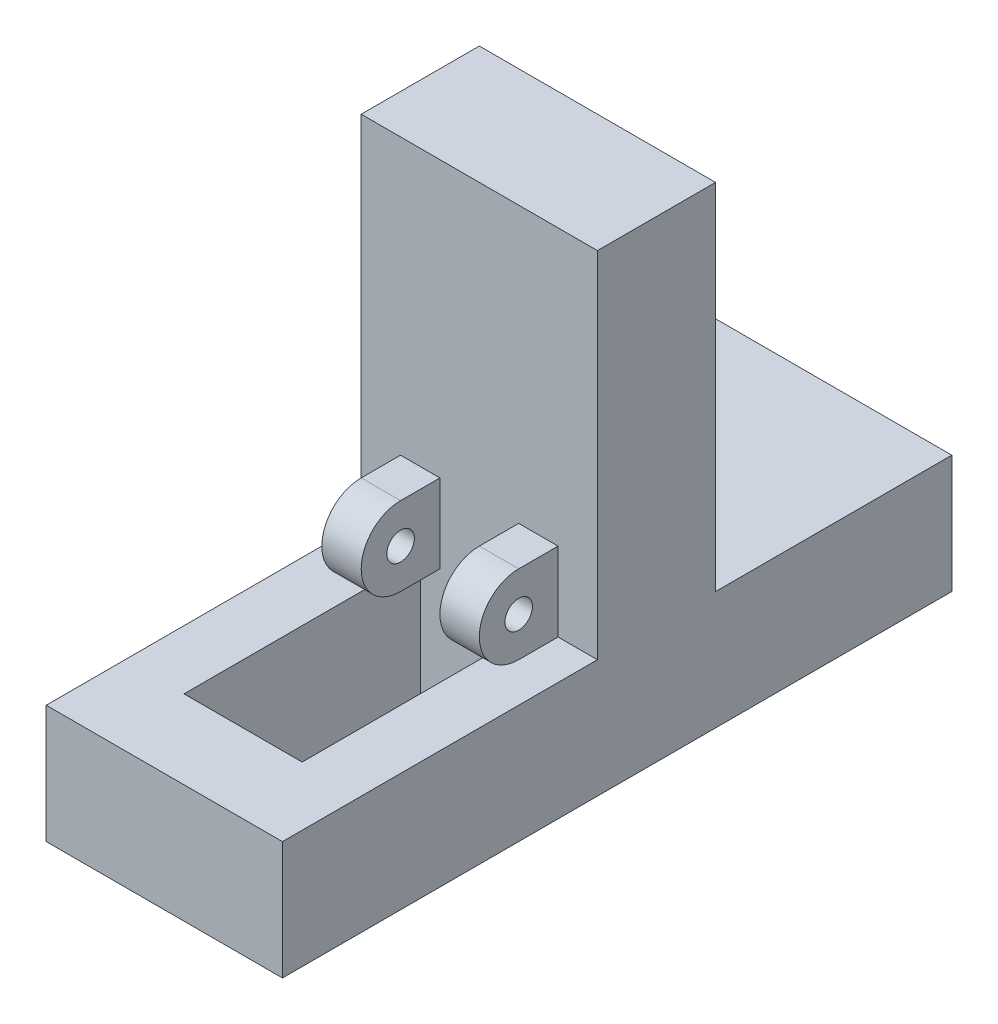
ISO-10303-21;
HEADER;
FILE_DESCRIPTION(('STEP AP214'),'2;1');
FILE_NAME('part.step','',(''),(''),'','','');
FILE_SCHEMA(('AUTOMOTIVE_DESIGN { 1 0 10303 214 1 1 1 1 }'));
ENDSEC;
DATA;
#1=APPLICATION_CONTEXT('core data for automotive mechanical design processes');
#2=APPLICATION_PROTOCOL_DEFINITION('international standard','automotive_design',2000,#1);
#3=PRODUCT_CONTEXT('',#1,'mechanical');
#4=PRODUCT('Part','Part','',(#3));
#5=PRODUCT_RELATED_PRODUCT_CATEGORY('part','',(#4));
#6=PRODUCT_DEFINITION_FORMATION('','',#4);
#7=PRODUCT_DEFINITION_CONTEXT('part definition',#1,'design');
#8=PRODUCT_DEFINITION('design','',#6,#7);
#9=PRODUCT_DEFINITION_SHAPE('','',#8);
#10=(LENGTH_UNIT() NAMED_UNIT(*) SI_UNIT(.MILLI.,.METRE.));
#11=(NAMED_UNIT(*) PLANE_ANGLE_UNIT() SI_UNIT($,.RADIAN.));
#12=(NAMED_UNIT(*) SI_UNIT($,.STERADIAN.) SOLID_ANGLE_UNIT());
#13=UNCERTAINTY_MEASURE_WITH_UNIT(LENGTH_MEASURE(1.E-05),#10,'distance_accuracy_value','');
#14=(GEOMETRIC_REPRESENTATION_CONTEXT(3) GLOBAL_UNCERTAINTY_ASSIGNED_CONTEXT((#13)) GLOBAL_UNIT_ASSIGNED_CONTEXT((#10,
#11,#12)) REPRESENTATION_CONTEXT('',''));
#15=CARTESIAN_POINT('',(0.,0.,0.));
#16=DIRECTION('',(0.,0.,1.));
#17=DIRECTION('',(1.,0.,0.));
#18=AXIS2_PLACEMENT_3D('',#15,#16,#17);
#19=CARTESIAN_POINT('',(0.,0.,15.));
#20=DIRECTION('',(0.,0.,-1.));
#21=DIRECTION('',(-1.,0.,0.));
#22=AXIS2_PLACEMENT_3D('',#19,#20,#21);
#23=PLANE('',#22);
#24=CARTESIAN_POINT('',(15.,10.,15.));
#25=DIRECTION('',(0.,0.,1.));
#26=DIRECTION('',(1.,0.,0.));
#27=AXIS2_PLACEMENT_3D('',#24,#25,#26);
#28=CIRCLE('',#27,1.75);
#29=CARTESIAN_POINT('',(16.75,10.,15.));
#30=VERTEX_POINT('',#29);
#31=EDGE_CURVE('E334',#30,#30,#28,.T.);
#32=ORIENTED_EDGE('',*,*,#31,.F.);
#33=EDGE_LOOP('',(#32));
#34=FACE_BOUND('',#33,.T.);
#35=DIRECTION('',(-1.,0.,0.));
#36=VECTOR('',#35,1.);
#37=CARTESIAN_POINT('',(30.,15.,15.));
#38=LINE('',#37,#36);
#39=CARTESIAN_POINT('',(30.,15.,15.));
#40=VERTEX_POINT('',#39);
#41=CARTESIAN_POINT('',(25.,15.,15.));
#42=VERTEX_POINT('',#41);
#43=EDGE_CURVE('E248',#40,#42,#38,.T.);
#44=ORIENTED_EDGE('',*,*,#43,.F.);
#45=DIRECTION('',(0.,1.,0.));
#46=VECTOR('',#45,1.);
#47=CARTESIAN_POINT('',(30.,0.,15.));
#48=LINE('',#47,#46);
#49=CARTESIAN_POINT('',(30.,60.,15.));
#50=VERTEX_POINT('',#49);
#51=EDGE_CURVE('E344',#40,#50,#48,.T.);
#52=ORIENTED_EDGE('',*,*,#51,.T.);
#53=DIRECTION('',(-1.,0.,0.));
#54=VECTOR('',#53,1.);
#55=CARTESIAN_POINT('',(0.,60.,15.));
#56=LINE('',#55,#54);
#57=CARTESIAN_POINT('',(0.,60.,15.));
#58=VERTEX_POINT('',#57);
#59=EDGE_CURVE('E346',#50,#58,#56,.T.);
#60=ORIENTED_EDGE('',*,*,#59,.T.);
#61=DIRECTION('',(0.,-1.,0.));
#62=VECTOR('',#61,1.);
#63=CARTESIAN_POINT('',(0.,0.,15.));
#64=LINE('',#63,#62);
#65=CARTESIAN_POINT('',(0.,15.,15.));
#66=VERTEX_POINT('',#65);
#67=EDGE_CURVE('E338',#58,#66,#64,.T.);
#68=ORIENTED_EDGE('',*,*,#67,.T.);
#69=DIRECTION('',(-1.,0.,0.));
#70=VECTOR('',#69,1.);
#71=CARTESIAN_POINT('',(0.,15.,15.));
#72=LINE('',#71,#70);
#73=CARTESIAN_POINT('',(5.,15.,15.));
#74=VERTEX_POINT('',#73);
#75=EDGE_CURVE('E259',#74,#66,#72,.T.);
#76=ORIENTED_EDGE('',*,*,#75,.F.);
#77=DIRECTION('',(0.,1.,0.));
#78=VECTOR('',#77,1.);
#79=CARTESIAN_POINT('',(5.,25.,15.));
#80=LINE('',#79,#78);
#81=CARTESIAN_POINT('',(5.,25.,15.));
#82=VERTEX_POINT('',#81);
#83=EDGE_CURVE('E274',#74,#82,#80,.T.);
#84=ORIENTED_EDGE('',*,*,#83,.T.);
#85=DIRECTION('',(1.,0.,0.));
#86=VECTOR('',#85,1.);
#87=CARTESIAN_POINT('',(-14.142135623731,25.,15.));
#88=LINE('',#87,#86);
#89=CARTESIAN_POINT('',(10.,25.,15.));
#90=VERTEX_POINT('',#89);
#91=EDGE_CURVE('E331',#82,#90,#88,.T.);
#92=ORIENTED_EDGE('',*,*,#91,.T.);
#93=DIRECTION('',(0.,-1.,0.));
#94=VECTOR('',#93,1.);
#95=CARTESIAN_POINT('',(10.,15.,15.));
#96=LINE('',#95,#94);
#97=CARTESIAN_POINT('',(10.,15.,15.));
#98=VERTEX_POINT('',#97);
#99=EDGE_CURVE('E278',#90,#98,#96,.T.);
#100=ORIENTED_EDGE('',*,*,#99,.T.);
#101=DIRECTION('',(1.,0.,0.));
#102=VECTOR('',#101,1.);
#103=CARTESIAN_POINT('',(-14.142135623731,15.,15.));
#104=LINE('',#103,#102);
#105=CARTESIAN_POINT('',(7.5,15.,15.));
#106=VERTEX_POINT('',#105);
#107=EDGE_CURVE('E322',#106,#98,#104,.T.);
#108=ORIENTED_EDGE('',*,*,#107,.F.);
#109=DIRECTION('',(0.,1.,0.));
#110=VECTOR('',#109,1.);
#111=CARTESIAN_POINT('',(7.5,0.,15.));
#112=LINE('',#111,#110);
#113=CARTESIAN_POINT('',(7.5,0.,15.));
#114=VERTEX_POINT('',#113);
#115=EDGE_CURVE('E254',#114,#106,#112,.T.);
#116=ORIENTED_EDGE('',*,*,#115,.F.);
#117=DIRECTION('',(1.,0.,0.));
#118=VECTOR('',#117,1.);
#119=CARTESIAN_POINT('',(0.,0.,15.));
#120=LINE('',#119,#118);
#121=CARTESIAN_POINT('',(22.5,0.,15.));
#122=VERTEX_POINT('',#121);
#123=EDGE_CURVE('E340',#114,#122,#120,.T.);
#124=ORIENTED_EDGE('',*,*,#123,.T.);
#125=DIRECTION('',(0.,-1.,0.));
#126=VECTOR('',#125,1.);
#127=CARTESIAN_POINT('',(22.5,0.,15.));
#128=LINE('',#127,#126);
#129=CARTESIAN_POINT('',(22.5,15.,15.));
#130=VERTEX_POINT('',#129);
#131=EDGE_CURVE('E246',#130,#122,#128,.T.);
#132=ORIENTED_EDGE('',*,*,#131,.F.);
#133=CARTESIAN_POINT('',(20.,15.,15.));
#134=VERTEX_POINT('',#133);
#135=EDGE_CURVE('E319',#134,#130,#104,.T.);
#136=ORIENTED_EDGE('',*,*,#135,.F.);
#137=DIRECTION('',(0.,1.,0.));
#138=VECTOR('',#137,1.);
#139=CARTESIAN_POINT('',(20.,15.,15.));
#140=LINE('',#139,#138);
#141=CARTESIAN_POINT('',(20.,25.,15.));
#142=VERTEX_POINT('',#141);
#143=EDGE_CURVE('E296',#134,#142,#140,.T.);
#144=ORIENTED_EDGE('',*,*,#143,.T.);
#145=CARTESIAN_POINT('',(25.,25.,15.));
#146=VERTEX_POINT('',#145);
#147=EDGE_CURVE('E318',#142,#146,#88,.T.);
#148=ORIENTED_EDGE('',*,*,#147,.T.);
#149=DIRECTION('',(0.,-1.,0.));
#150=VECTOR('',#149,1.);
#151=CARTESIAN_POINT('',(25.,25.,15.));
#152=LINE('',#151,#150);
#153=EDGE_CURVE('E288',#146,#42,#152,.T.);
#154=ORIENTED_EDGE('',*,*,#153,.T.);
#155=EDGE_LOOP('',(#44,#52,#60,#68,#76,#84,#92,#100,#108,#116,#124,#132,#136,#144,#148,#154));
#156=FACE_BOUND('',#155,.T.);
#157=ADVANCED_FACE('F39',(#34,#156),#23,.F.);
#158=CARTESIAN_POINT('',(-14.142135623731,15.,15.));
#159=DIRECTION('',(0.,-1.,0.));
#160=DIRECTION('',(0.,0.,-1.));
#161=AXIS2_PLACEMENT_3D('',#158,#159,#160);
#162=PLANE('',#161);
#163=ORIENTED_EDGE('',*,*,#135,.T.);
#164=DIRECTION('',(0.,0.,-1.));
#165=VECTOR('',#164,1.);
#166=CARTESIAN_POINT('',(22.5,15.,45.));
#167=LINE('',#166,#165);
#168=CARTESIAN_POINT('',(22.5,15.,20.));
#169=VERTEX_POINT('',#168);
#170=EDGE_CURVE('E238',#169,#130,#167,.T.);
#171=ORIENTED_EDGE('',*,*,#170,.F.);
#172=DIRECTION('',(1.,0.,0.));
#173=VECTOR('',#172,1.);
#174=CARTESIAN_POINT('',(-14.142135623731,15.,20.));
#175=LINE('',#174,#173);
#176=CARTESIAN_POINT('',(20.,15.,20.));
#177=VERTEX_POINT('',#176);
#178=EDGE_CURVE('E324',#177,#169,#175,.T.);
#179=ORIENTED_EDGE('',*,*,#178,.F.);
#180=DIRECTION('',(0.,0.,-1.));
#181=VECTOR('',#180,1.);
#182=CARTESIAN_POINT('',(20.,15.,25.));
#183=LINE('',#182,#181);
#184=EDGE_CURVE('E287',#177,#134,#183,.T.);
#185=ORIENTED_EDGE('',*,*,#184,.T.);
#186=EDGE_LOOP('',(#163,#171,#179,#185));
#187=FACE_BOUND('',#186,.T.);
#188=ADVANCED_FACE('F388',(#187),#162,.T.);
#189=CARTESIAN_POINT('',(7.5,15.,20.));
#190=VERTEX_POINT('',#189);
#191=CARTESIAN_POINT('',(10.,15.,20.));
#192=VERTEX_POINT('',#191);
#193=EDGE_CURVE('E64',#190,#192,#175,.T.);
#194=ORIENTED_EDGE('',*,*,#193,.F.);
#195=DIRECTION('',(0.,0.,-1.));
#196=VECTOR('',#195,1.);
#197=CARTESIAN_POINT('',(7.5,15.,45.));
#198=LINE('',#197,#196);
#199=EDGE_CURVE('E266',#190,#106,#198,.T.);
#200=ORIENTED_EDGE('',*,*,#199,.T.);
#201=ORIENTED_EDGE('',*,*,#107,.T.);
#202=DIRECTION('',(0.,0.,-1.));
#203=VECTOR('',#202,1.);
#204=CARTESIAN_POINT('',(10.,15.,25.));
#205=LINE('',#204,#203);
#206=EDGE_CURVE('E284',#192,#98,#205,.T.);
#207=ORIENTED_EDGE('',*,*,#206,.F.);
#208=EDGE_LOOP('',(#194,#200,#201,#207));
#209=FACE_BOUND('',#208,.T.);
#210=ADVANCED_FACE('F394',(#209),#162,.T.);
#211=CARTESIAN_POINT('',(0.,0.,15.));
#212=DIRECTION('',(1.,0.,0.));
#213=DIRECTION('',(0.,0.,-1.));
#214=AXIS2_PLACEMENT_3D('',#211,#212,#213);
#215=PLANE('',#214);
#216=DIRECTION('',(0.,0.,-1.));
#217=VECTOR('',#216,1.);
#218=CARTESIAN_POINT('',(0.,0.,15.));
#219=LINE('',#218,#217);
#220=CARTESIAN_POINT('',(0.,0.,55.));
#221=VERTEX_POINT('',#220);
#222=CARTESIAN_POINT('',(0.,0.,-30.));
#223=VERTEX_POINT('',#222);
#224=EDGE_CURVE('E11',#221,#223,#219,.T.);
#225=ORIENTED_EDGE('',*,*,#224,.F.);
#226=DIRECTION('',(0.,-1.,0.));
#227=VECTOR('',#226,1.);
#228=CARTESIAN_POINT('',(0.,15.,55.));
#229=LINE('',#228,#227);
#230=CARTESIAN_POINT('',(0.,15.,55.));
#231=VERTEX_POINT('',#230);
#232=EDGE_CURVE('E222',#231,#221,#229,.T.);
#233=ORIENTED_EDGE('',*,*,#232,.F.);
#234=DIRECTION('',(0.,0.,-1.));
#235=VECTOR('',#234,1.);
#236=CARTESIAN_POINT('',(0.,15.,45.));
#237=LINE('',#236,#235);
#238=EDGE_CURVE('E258',#231,#66,#237,.T.);
#239=ORIENTED_EDGE('',*,*,#238,.T.);
#240=ORIENTED_EDGE('',*,*,#67,.F.);
#241=DIRECTION('',(0.,0.,-1.));
#242=VECTOR('',#241,1.);
#243=CARTESIAN_POINT('',(0.,60.,15.));
#244=LINE('',#243,#242);
#245=CARTESIAN_POINT('',(0.,60.,0.));
#246=VERTEX_POINT('',#245);
#247=EDGE_CURVE('E348',#58,#246,#244,.T.);
#248=ORIENTED_EDGE('',*,*,#247,.T.);
#249=DIRECTION('',(0.,-1.,0.));
#250=VECTOR('',#249,1.);
#251=CARTESIAN_POINT('',(0.,0.,0.));
#252=LINE('',#251,#250);
#253=CARTESIAN_POINT('',(0.,15.,0.));
#254=VERTEX_POINT('',#253);
#255=EDGE_CURVE('E337',#246,#254,#252,.T.);
#256=ORIENTED_EDGE('',*,*,#255,.T.);
#257=DIRECTION('',(0.,0.,1.));
#258=VECTOR('',#257,1.);
#259=CARTESIAN_POINT('',(0.,15.,-30.));
#260=LINE('',#259,#258);
#261=CARTESIAN_POINT('',(0.,15.,-30.));
#262=VERTEX_POINT('',#261);
#263=EDGE_CURVE('E218',#262,#254,#260,.T.);
#264=ORIENTED_EDGE('',*,*,#263,.F.);
#265=DIRECTION('',(0.,1.,0.));
#266=VECTOR('',#265,1.);
#267=CARTESIAN_POINT('',(0.,0.,-30.));
#268=LINE('',#267,#266);
#269=EDGE_CURVE('E202',#223,#262,#268,.T.);
#270=ORIENTED_EDGE('',*,*,#269,.F.);
#271=EDGE_LOOP('',(#225,#233,#239,#240,#248,#256,#264,#270));
#272=FACE_BOUND('',#271,.T.);
#273=ADVANCED_FACE('F41',(#272),#215,.F.);
#274=CARTESIAN_POINT('',(-14.142135623731,25.,15.));
#275=DIRECTION('',(0.,1.,0.));
#276=DIRECTION('',(0.,0.,1.));
#277=AXIS2_PLACEMENT_3D('',#274,#275,#276);
#278=PLANE('',#277);
#279=ORIENTED_EDGE('',*,*,#91,.F.);
#280=DIRECTION('',(0.,0.,-1.));
#281=VECTOR('',#280,1.);
#282=CARTESIAN_POINT('',(5.,25.,25.));
#283=LINE('',#282,#281);
#284=CARTESIAN_POINT('',(5.,25.,20.));
#285=VERTEX_POINT('',#284);
#286=EDGE_CURVE('E277',#285,#82,#283,.T.);
#287=ORIENTED_EDGE('',*,*,#286,.F.);
#288=DIRECTION('',(1.,0.,0.));
#289=VECTOR('',#288,1.);
#290=CARTESIAN_POINT('',(-14.142135623731,25.,20.));
#291=LINE('',#290,#289);
#292=CARTESIAN_POINT('',(10.,25.,20.));
#293=VERTEX_POINT('',#292);
#294=EDGE_CURVE('E327',#285,#293,#291,.T.);
#295=ORIENTED_EDGE('',*,*,#294,.T.);
#296=DIRECTION('',(0.,0.,-1.));
#297=VECTOR('',#296,1.);
#298=CARTESIAN_POINT('',(10.,25.,25.));
#299=LINE('',#298,#297);
#300=EDGE_CURVE('E293',#293,#90,#299,.T.);
#301=ORIENTED_EDGE('',*,*,#300,.T.);
#302=EDGE_LOOP('',(#279,#287,#295,#301));
#303=FACE_BOUND('',#302,.T.);
#304=ADVANCED_FACE('F462',(#303),#278,.T.);
#305=ORIENTED_EDGE('',*,*,#147,.F.);
#306=DIRECTION('',(0.,0.,-1.));
#307=VECTOR('',#306,1.);
#308=CARTESIAN_POINT('',(20.,25.,25.));
#309=LINE('',#308,#307);
#310=CARTESIAN_POINT('',(20.,25.,20.));
#311=VERTEX_POINT('',#310);
#312=EDGE_CURVE('E291',#311,#142,#309,.T.);
#313=ORIENTED_EDGE('',*,*,#312,.F.);
#314=CARTESIAN_POINT('',(25.,25.,20.));
#315=VERTEX_POINT('',#314);
#316=EDGE_CURVE('E328',#311,#315,#291,.T.);
#317=ORIENTED_EDGE('',*,*,#316,.T.);
#318=DIRECTION('',(0.,0.,-1.));
#319=VECTOR('',#318,1.);
#320=CARTESIAN_POINT('',(25.,25.,25.));
#321=LINE('',#320,#319);
#322=EDGE_CURVE('E273',#315,#146,#321,.T.);
#323=ORIENTED_EDGE('',*,*,#322,.T.);
#324=EDGE_LOOP('',(#305,#313,#317,#323));
#325=FACE_BOUND('',#324,.T.);
#326=ADVANCED_FACE('F442',(#325),#278,.T.);
#327=CARTESIAN_POINT('',(-14.142135623731,20.,20.));
#328=DIRECTION('',(1.,0.,0.));
#329=DIRECTION('',(0.,0.,-1.));
#330=AXIS2_PLACEMENT_3D('',#327,#328,#329);
#331=CYLINDRICAL_SURFACE('',#330,5.);
#332=ORIENTED_EDGE('',*,*,#294,.F.);
#333=CARTESIAN_POINT('',(5.,20.,20.));
#334=DIRECTION('',(-1.,0.,0.));
#335=DIRECTION('',(0.,-1.,0.));
#336=AXIS2_PLACEMENT_3D('',#333,#334,#335);
#337=CIRCLE('',#336,5.);
#338=CARTESIAN_POINT('',(5.,15.,20.));
#339=VERTEX_POINT('',#338);
#340=EDGE_CURVE('E316',#285,#339,#337,.F.);
#341=ORIENTED_EDGE('',*,*,#340,.T.);
#342=EDGE_CURVE('E323',#339,#190,#175,.T.);
#343=ORIENTED_EDGE('',*,*,#342,.T.);
#344=ORIENTED_EDGE('',*,*,#193,.T.);
#345=CARTESIAN_POINT('',(10.,20.,20.));
#346=DIRECTION('',(1.,0.,0.));
#347=DIRECTION('',(0.,0.,-1.));
#348=AXIS2_PLACEMENT_3D('',#345,#346,#347);
#349=CIRCLE('',#348,5.);
#350=EDGE_CURVE('E314',#192,#293,#349,.F.);
#351=ORIENTED_EDGE('',*,*,#350,.T.);
#352=EDGE_LOOP('',(#332,#341,#343,#344,#351));
#353=FACE_BOUND('',#352,.T.);
#354=ADVANCED_FACE('F455',(#353),#331,.T.);
#355=CARTESIAN_POINT('',(20.,20.,20.));
#356=DIRECTION('',(-1.,0.,0.));
#357=DIRECTION('',(0.,0.,1.));
#358=AXIS2_PLACEMENT_3D('',#355,#356,#357);
#359=CIRCLE('',#358,5.);
#360=EDGE_CURVE('E311',#311,#177,#359,.F.);
#361=ORIENTED_EDGE('',*,*,#360,.T.);
#362=ORIENTED_EDGE('',*,*,#178,.T.);
#363=DIRECTION('',(1.,0.,0.));
#364=VECTOR('',#363,1.);
#365=CARTESIAN_POINT('',(-14.142135623731,15.,20.));
#366=LINE('',#365,#364);
#367=CARTESIAN_POINT('',(25.,15.,20.));
#368=VERTEX_POINT('',#367);
#369=EDGE_CURVE('E250',#368,#169,#366,.F.);
#370=ORIENTED_EDGE('',*,*,#369,.F.);
#371=CARTESIAN_POINT('',(25.,20.,20.));
#372=DIRECTION('',(1.,0.,0.));
#373=DIRECTION('',(0.,0.,-1.));
#374=AXIS2_PLACEMENT_3D('',#371,#372,#373);
#375=CIRCLE('',#374,5.);
#376=EDGE_CURVE('E308',#368,#315,#375,.F.);
#377=ORIENTED_EDGE('',*,*,#376,.T.);
#378=ORIENTED_EDGE('',*,*,#316,.F.);
#379=EDGE_LOOP('',(#361,#362,#370,#377,#378));
#380=FACE_BOUND('',#379,.T.);
#381=ADVANCED_FACE('F406',(#380),#331,.T.);
#382=CARTESIAN_POINT('',(0.,0.,0.));
#383=DIRECTION('',(0.,0.,-1.));
#384=DIRECTION('',(-1.,0.,0.));
#385=AXIS2_PLACEMENT_3D('',#382,#383,#384);
#386=PLANE('',#385);
#387=DIRECTION('',(1.,0.,0.));
#388=VECTOR('',#387,1.);
#389=CARTESIAN_POINT('',(30.,15.,0.));
#390=LINE('',#389,#388);
#391=CARTESIAN_POINT('',(30.,15.,0.));
#392=VERTEX_POINT('',#391);
#393=EDGE_CURVE('E56',#254,#392,#390,.T.);
#394=ORIENTED_EDGE('',*,*,#393,.F.);
#395=ORIENTED_EDGE('',*,*,#255,.F.);
#396=DIRECTION('',(-1.,0.,0.));
#397=VECTOR('',#396,1.);
#398=CARTESIAN_POINT('',(0.,60.,0.));
#399=LINE('',#398,#397);
#400=CARTESIAN_POINT('',(30.,60.,0.));
#401=VERTEX_POINT('',#400);
#402=EDGE_CURVE('E341',#401,#246,#399,.T.);
#403=ORIENTED_EDGE('',*,*,#402,.F.);
#404=DIRECTION('',(0.,1.,0.));
#405=VECTOR('',#404,1.);
#406=CARTESIAN_POINT('',(30.,0.,0.));
#407=LINE('',#406,#405);
#408=EDGE_CURVE('E350',#392,#401,#407,.T.);
#409=ORIENTED_EDGE('',*,*,#408,.F.);
#410=EDGE_LOOP('',(#394,#395,#403,#409));
#411=FACE_BOUND('',#410,.T.);
#412=ADVANCED_FACE('F403',(#411),#386,.T.);
#413=CARTESIAN_POINT('',(0.,0.,15.));
#414=DIRECTION('',(0.,1.,0.));
#415=DIRECTION('',(0.,0.,1.));
#416=AXIS2_PLACEMENT_3D('',#413,#414,#415);
#417=PLANE('',#416);
#418=DIRECTION('',(0.,0.,-1.));
#419=VECTOR('',#418,1.);
#420=CARTESIAN_POINT('',(7.5,0.,45.));
#421=LINE('',#420,#419);
#422=CARTESIAN_POINT('',(7.5,0.,45.));
#423=VERTEX_POINT('',#422);
#424=EDGE_CURVE('E270',#423,#114,#421,.T.);
#425=ORIENTED_EDGE('',*,*,#424,.F.);
#426=DIRECTION('',(1.,0.,0.));
#427=VECTOR('',#426,1.);
#428=CARTESIAN_POINT('',(0.,0.,45.));
#429=LINE('',#428,#427);
#430=CARTESIAN_POINT('',(22.5,0.,45.));
#431=VERTEX_POINT('',#430);
#432=EDGE_CURVE('E221',#423,#431,#429,.T.);
#433=ORIENTED_EDGE('',*,*,#432,.T.);
#434=DIRECTION('',(0.,0.,-1.));
#435=VECTOR('',#434,1.);
#436=CARTESIAN_POINT('',(22.5,0.,45.));
#437=LINE('',#436,#435);
#438=EDGE_CURVE('E242',#431,#122,#437,.T.);
#439=ORIENTED_EDGE('',*,*,#438,.T.);
#440=ORIENTED_EDGE('',*,*,#123,.F.);
#441=EDGE_LOOP('',(#425,#433,#439,#440));
#442=FACE_BOUND('',#441,.T.);
#443=ORIENTED_EDGE('',*,*,#224,.T.);
#444=DIRECTION('',(-1.,0.,0.));
#445=VECTOR('',#444,1.);
#446=CARTESIAN_POINT('',(30.,0.,-30.));
#447=LINE('',#446,#445);
#448=CARTESIAN_POINT('',(30.,0.,-30.));
#449=VERTEX_POINT('',#448);
#450=EDGE_CURVE('E198',#449,#223,#447,.T.);
#451=ORIENTED_EDGE('',*,*,#450,.F.);
#452=DIRECTION('',(0.,0.,-1.));
#453=VECTOR('',#452,1.);
#454=CARTESIAN_POINT('',(30.,0.,15.));
#455=LINE('',#454,#453);
#456=CARTESIAN_POINT('',(30.,0.,55.));
#457=VERTEX_POINT('',#456);
#458=EDGE_CURVE('E48',#457,#449,#455,.T.);
#459=ORIENTED_EDGE('',*,*,#458,.F.);
#460=DIRECTION('',(1.,0.,0.));
#461=VECTOR('',#460,1.);
#462=CARTESIAN_POINT('',(0.,0.,55.));
#463=LINE('',#462,#461);
#464=EDGE_CURVE('E225',#221,#457,#463,.T.);
#465=ORIENTED_EDGE('',*,*,#464,.F.);
#466=EDGE_LOOP('',(#443,#451,#459,#465));
#467=FACE_BOUND('',#466,.T.);
#468=ADVANCED_FACE('F199',(#442,#467),#417,.F.);
#469=CARTESIAN_POINT('',(30.,0.,15.));
#470=DIRECTION('',(-1.,0.,0.));
#471=DIRECTION('',(0.,0.,1.));
#472=AXIS2_PLACEMENT_3D('',#469,#470,#471);
#473=PLANE('',#472);
#474=DIRECTION('',(0.,0.,-1.));
#475=VECTOR('',#474,1.);
#476=CARTESIAN_POINT('',(30.,60.,15.));
#477=LINE('',#476,#475);
#478=EDGE_CURVE('E195',#50,#401,#477,.T.);
#479=ORIENTED_EDGE('',*,*,#478,.F.);
#480=ORIENTED_EDGE('',*,*,#51,.F.);
#481=DIRECTION('',(0.,0.,-1.));
#482=VECTOR('',#481,1.);
#483=CARTESIAN_POINT('',(30.,15.,45.));
#484=LINE('',#483,#482);
#485=CARTESIAN_POINT('',(30.,15.,55.));
#486=VERTEX_POINT('',#485);
#487=EDGE_CURVE('E232',#486,#40,#484,.T.);
#488=ORIENTED_EDGE('',*,*,#487,.F.);
#489=DIRECTION('',(0.,1.,0.));
#490=VECTOR('',#489,1.);
#491=CARTESIAN_POINT('',(30.,15.,55.));
#492=LINE('',#491,#490);
#493=EDGE_CURVE('E191',#457,#486,#492,.T.);
#494=ORIENTED_EDGE('',*,*,#493,.F.);
#495=ORIENTED_EDGE('',*,*,#458,.T.);
#496=DIRECTION('',(0.,-1.,0.));
#497=VECTOR('',#496,1.);
#498=CARTESIAN_POINT('',(30.,0.,-30.));
#499=LINE('',#498,#497);
#500=CARTESIAN_POINT('',(30.,15.,-30.));
#501=VERTEX_POINT('',#500);
#502=EDGE_CURVE('E189',#501,#449,#499,.T.);
#503=ORIENTED_EDGE('',*,*,#502,.F.);
#504=DIRECTION('',(0.,0.,1.));
#505=VECTOR('',#504,1.);
#506=CARTESIAN_POINT('',(30.,15.,-30.));
#507=LINE('',#506,#505);
#508=EDGE_CURVE('E215',#501,#392,#507,.T.);
#509=ORIENTED_EDGE('',*,*,#508,.T.);
#510=ORIENTED_EDGE('',*,*,#408,.T.);
#511=EDGE_LOOP('',(#479,#480,#488,#494,#495,#503,#509,#510));
#512=FACE_BOUND('',#511,.T.);
#513=ADVANCED_FACE('F186',(#512),#473,.F.);
#514=CARTESIAN_POINT('',(0.,60.,15.));
#515=DIRECTION('',(0.,-1.,0.));
#516=DIRECTION('',(0.,0.,-1.));
#517=AXIS2_PLACEMENT_3D('',#514,#515,#516);
#518=PLANE('',#517);
#519=ORIENTED_EDGE('',*,*,#402,.T.);
#520=ORIENTED_EDGE('',*,*,#247,.F.);
#521=ORIENTED_EDGE('',*,*,#59,.F.);
#522=ORIENTED_EDGE('',*,*,#478,.T.);
#523=EDGE_LOOP('',(#519,#520,#521,#522));
#524=FACE_BOUND('',#523,.T.);
#525=ADVANCED_FACE('F407',(#524),#518,.F.);
#526=CARTESIAN_POINT('',(15.,10.,15.));
#527=DIRECTION('',(0.,0.,-1.));
#528=DIRECTION('',(-1.,0.,0.));
#529=AXIS2_PLACEMENT_3D('',#526,#527,#528);
#530=CYLINDRICAL_SURFACE('',#529,1.75);
#531=ORIENTED_EDGE('',*,*,#31,.T.);
#532=EDGE_LOOP('',(#531));
#533=FACE_BOUND('',#532,.T.);
#534=CARTESIAN_POINT('',(15.,10.,-30.));
#535=DIRECTION('',(0.,0.,-1.));
#536=DIRECTION('',(-1.,0.,0.));
#537=AXIS2_PLACEMENT_3D('',#534,#535,#536);
#538=CIRCLE('',#537,1.75);
#539=CARTESIAN_POINT('',(13.25,10.,-30.));
#540=VERTEX_POINT('',#539);
#541=EDGE_CURVE('E210',#540,#540,#538,.T.);
#542=ORIENTED_EDGE('',*,*,#541,.T.);
#543=EDGE_LOOP('',(#542));
#544=FACE_BOUND('',#543,.T.);
#545=ADVANCED_FACE('F401',(#533,#544),#530,.F.);
#546=CARTESIAN_POINT('',(25.,25.,25.));
#547=DIRECTION('',(1.,0.,0.));
#548=DIRECTION('',(0.,0.,-1.));
#549=AXIS2_PLACEMENT_3D('',#546,#547,#548);
#550=PLANE('',#549);
#551=DIRECTION('',(0.,0.,-1.));
#552=VECTOR('',#551,1.);
#553=CARTESIAN_POINT('',(25.,15.,25.));
#554=LINE('',#553,#552);
#555=EDGE_CURVE('E303',#368,#42,#554,.T.);
#556=ORIENTED_EDGE('',*,*,#555,.T.);
#557=ORIENTED_EDGE('',*,*,#153,.F.);
#558=ORIENTED_EDGE('',*,*,#322,.F.);
#559=ORIENTED_EDGE('',*,*,#376,.F.);
#560=EDGE_LOOP('',(#556,#557,#558,#559));
#561=FACE_BOUND('',#560,.T.);
#562=CARTESIAN_POINT('',(25.,20.,20.));
#563=DIRECTION('',(1.,0.,0.));
#564=DIRECTION('',(0.,0.,-1.));
#565=AXIS2_PLACEMENT_3D('',#562,#563,#564);
#566=CIRCLE('',#565,1.75);
#567=CARTESIAN_POINT('',(25.,20.,18.25));
#568=VERTEX_POINT('',#567);
#569=EDGE_CURVE('E283',#568,#568,#566,.F.);
#570=ORIENTED_EDGE('',*,*,#569,.T.);
#571=EDGE_LOOP('',(#570));
#572=FACE_BOUND('',#571,.T.);
#573=ADVANCED_FACE('F437',(#561,#572),#550,.T.);
#574=CARTESIAN_POINT('',(10.,15.,25.));
#575=DIRECTION('',(1.,0.,0.));
#576=DIRECTION('',(0.,0.,-1.));
#577=AXIS2_PLACEMENT_3D('',#574,#575,#576);
#578=PLANE('',#577);
#579=ORIENTED_EDGE('',*,*,#206,.T.);
#580=ORIENTED_EDGE('',*,*,#99,.F.);
#581=ORIENTED_EDGE('',*,*,#300,.F.);
#582=ORIENTED_EDGE('',*,*,#350,.F.);
#583=EDGE_LOOP('',(#579,#580,#581,#582));
#584=FACE_BOUND('',#583,.T.);
#585=CARTESIAN_POINT('',(10.,20.,20.));
#586=DIRECTION('',(1.,0.,0.));
#587=DIRECTION('',(0.,0.,-1.));
#588=AXIS2_PLACEMENT_3D('',#585,#586,#587);
#589=CIRCLE('',#588,1.75);
#590=CARTESIAN_POINT('',(10.,20.,18.25));
#591=VERTEX_POINT('',#590);
#592=EDGE_CURVE('E313',#591,#591,#589,.F.);
#593=ORIENTED_EDGE('',*,*,#592,.T.);
#594=EDGE_LOOP('',(#593));
#595=FACE_BOUND('',#594,.T.);
#596=ADVANCED_FACE('F363',(#584,#595),#578,.T.);
#597=CARTESIAN_POINT('',(20.,15.,25.));
#598=DIRECTION('',(-1.,0.,0.));
#599=DIRECTION('',(0.,0.,1.));
#600=AXIS2_PLACEMENT_3D('',#597,#598,#599);
#601=PLANE('',#600);
#602=ORIENTED_EDGE('',*,*,#360,.F.);
#603=ORIENTED_EDGE('',*,*,#312,.T.);
#604=ORIENTED_EDGE('',*,*,#143,.F.);
#605=ORIENTED_EDGE('',*,*,#184,.F.);
#606=EDGE_LOOP('',(#602,#603,#604,#605));
#607=FACE_BOUND('',#606,.T.);
#608=CARTESIAN_POINT('',(20.,20.,20.));
#609=DIRECTION('',(-1.,0.,0.));
#610=DIRECTION('',(0.,0.,1.));
#611=AXIS2_PLACEMENT_3D('',#608,#609,#610);
#612=CIRCLE('',#611,1.75);
#613=CARTESIAN_POINT('',(20.,20.,21.75));
#614=VERTEX_POINT('',#613);
#615=EDGE_CURVE('E310',#614,#614,#612,.F.);
#616=ORIENTED_EDGE('',*,*,#615,.T.);
#617=EDGE_LOOP('',(#616));
#618=FACE_BOUND('',#617,.T.);
#619=ADVANCED_FACE('F369',(#607,#618),#601,.T.);
#620=CARTESIAN_POINT('',(-14.142135623731,20.,20.));
#621=DIRECTION('',(1.,0.,0.));
#622=DIRECTION('',(0.,0.,-1.));
#623=AXIS2_PLACEMENT_3D('',#620,#621,#622);
#624=CYLINDRICAL_SURFACE('',#623,1.75);
#625=ORIENTED_EDGE('',*,*,#592,.F.);
#626=EDGE_LOOP('',(#625));
#627=FACE_BOUND('',#626,.T.);
#628=CARTESIAN_POINT('',(5.,20.,20.));
#629=DIRECTION('',(-1.,0.,0.));
#630=DIRECTION('',(0.,-1.,0.));
#631=AXIS2_PLACEMENT_3D('',#628,#629,#630);
#632=CIRCLE('',#631,1.75);
#633=CARTESIAN_POINT('',(5.,18.25,20.));
#634=VERTEX_POINT('',#633);
#635=EDGE_CURVE('E43',#634,#634,#632,.F.);
#636=ORIENTED_EDGE('',*,*,#635,.F.);
#637=EDGE_LOOP('',(#636));
#638=FACE_BOUND('',#637,.T.);
#639=ADVANCED_FACE('F365',(#627,#638),#624,.F.);
#640=CARTESIAN_POINT('',(5.,25.,25.));
#641=DIRECTION('',(-1.,0.,0.));
#642=DIRECTION('',(0.,-1.,0.));
#643=AXIS2_PLACEMENT_3D('',#640,#641,#642);
#644=PLANE('',#643);
#645=ORIENTED_EDGE('',*,*,#286,.T.);
#646=ORIENTED_EDGE('',*,*,#83,.F.);
#647=DIRECTION('',(0.,0.,-1.));
#648=VECTOR('',#647,1.);
#649=CARTESIAN_POINT('',(5.,15.,25.));
#650=LINE('',#649,#648);
#651=EDGE_CURVE('E280',#339,#74,#650,.T.);
#652=ORIENTED_EDGE('',*,*,#651,.F.);
#653=ORIENTED_EDGE('',*,*,#340,.F.);
#654=EDGE_LOOP('',(#645,#646,#652,#653));
#655=FACE_BOUND('',#654,.T.);
#656=ORIENTED_EDGE('',*,*,#635,.T.);
#657=EDGE_LOOP('',(#656));
#658=FACE_BOUND('',#657,.T.);
#659=ADVANCED_FACE('F368',(#655,#658),#644,.T.);
#660=ORIENTED_EDGE('',*,*,#569,.F.);
#661=EDGE_LOOP('',(#660));
#662=FACE_BOUND('',#661,.T.);
#663=ORIENTED_EDGE('',*,*,#615,.F.);
#664=EDGE_LOOP('',(#663));
#665=FACE_BOUND('',#664,.T.);
#666=ADVANCED_FACE('F371',(#662,#665),#624,.F.);
#667=CARTESIAN_POINT('',(0.,15.,45.));
#668=DIRECTION('',(0.,-1.,0.));
#669=DIRECTION('',(0.,0.,-1.));
#670=AXIS2_PLACEMENT_3D('',#667,#668,#669);
#671=PLANE('',#670);
#672=CARTESIAN_POINT('',(7.5,15.,45.));
#673=VERTEX_POINT('',#672);
#674=EDGE_CURVE('E267',#673,#190,#198,.T.);
#675=ORIENTED_EDGE('',*,*,#674,.T.);
#676=ORIENTED_EDGE('',*,*,#342,.F.);
#677=ORIENTED_EDGE('',*,*,#651,.T.);
#678=ORIENTED_EDGE('',*,*,#75,.T.);
#679=ORIENTED_EDGE('',*,*,#238,.F.);
#680=DIRECTION('',(-1.,0.,0.));
#681=VECTOR('',#680,1.);
#682=CARTESIAN_POINT('',(0.,15.,55.));
#683=LINE('',#682,#681);
#684=EDGE_CURVE('E229',#486,#231,#683,.T.);
#685=ORIENTED_EDGE('',*,*,#684,.F.);
#686=ORIENTED_EDGE('',*,*,#487,.T.);
#687=ORIENTED_EDGE('',*,*,#43,.T.);
#688=ORIENTED_EDGE('',*,*,#555,.F.);
#689=ORIENTED_EDGE('',*,*,#369,.T.);
#690=CARTESIAN_POINT('',(22.5,15.,45.));
#691=VERTEX_POINT('',#690);
#692=EDGE_CURVE('E239',#691,#169,#167,.T.);
#693=ORIENTED_EDGE('',*,*,#692,.F.);
#694=DIRECTION('',(-1.,0.,0.));
#695=VECTOR('',#694,1.);
#696=CARTESIAN_POINT('',(0.,15.,45.));
#697=LINE('',#696,#695);
#698=EDGE_CURVE('E226',#691,#673,#697,.T.);
#699=ORIENTED_EDGE('',*,*,#698,.T.);
#700=EDGE_LOOP('',(#675,#676,#677,#678,#679,#685,#686,#687,#688,#689,#693,#699));
#701=FACE_BOUND('',#700,.T.);
#702=ADVANCED_FACE('F383',(#701),#671,.F.);
#703=CARTESIAN_POINT('',(7.5,0.,45.));
#704=DIRECTION('',(-1.,0.,0.));
#705=DIRECTION('',(0.,0.,1.));
#706=AXIS2_PLACEMENT_3D('',#703,#704,#705);
#707=PLANE('',#706);
#708=ORIENTED_EDGE('',*,*,#115,.T.);
#709=ORIENTED_EDGE('',*,*,#199,.F.);
#710=ORIENTED_EDGE('',*,*,#674,.F.);
#711=DIRECTION('',(0.,1.,0.));
#712=VECTOR('',#711,1.);
#713=CARTESIAN_POINT('',(7.5,0.,45.));
#714=LINE('',#713,#712);
#715=EDGE_CURVE('E255',#423,#673,#714,.T.);
#716=ORIENTED_EDGE('',*,*,#715,.F.);
#717=ORIENTED_EDGE('',*,*,#424,.T.);
#718=EDGE_LOOP('',(#708,#709,#710,#716,#717));
#719=FACE_BOUND('',#718,.T.);
#720=ADVANCED_FACE('F420',(#719),#707,.F.);
#721=CARTESIAN_POINT('',(22.5,0.,45.));
#722=DIRECTION('',(1.,0.,0.));
#723=DIRECTION('',(0.,0.,-1.));
#724=AXIS2_PLACEMENT_3D('',#721,#722,#723);
#725=PLANE('',#724);
#726=ORIENTED_EDGE('',*,*,#131,.T.);
#727=ORIENTED_EDGE('',*,*,#438,.F.);
#728=DIRECTION('',(0.,-1.,0.));
#729=VECTOR('',#728,1.);
#730=CARTESIAN_POINT('',(22.5,0.,45.));
#731=LINE('',#730,#729);
#732=EDGE_CURVE('E245',#691,#431,#731,.T.);
#733=ORIENTED_EDGE('',*,*,#732,.F.);
#734=ORIENTED_EDGE('',*,*,#692,.T.);
#735=ORIENTED_EDGE('',*,*,#170,.T.);
#736=EDGE_LOOP('',(#726,#727,#733,#734,#735));
#737=FACE_BOUND('',#736,.T.);
#738=ADVANCED_FACE('F427',(#737),#725,.F.);
#739=CARTESIAN_POINT('',(0.,0.,45.));
#740=DIRECTION('',(0.,0.,1.));
#741=DIRECTION('',(1.,0.,0.));
#742=AXIS2_PLACEMENT_3D('',#739,#740,#741);
#743=PLANE('',#742);
#744=ORIENTED_EDGE('',*,*,#432,.F.);
#745=ORIENTED_EDGE('',*,*,#715,.T.);
#746=ORIENTED_EDGE('',*,*,#698,.F.);
#747=ORIENTED_EDGE('',*,*,#732,.T.);
#748=EDGE_LOOP('',(#744,#745,#746,#747));
#749=FACE_BOUND('',#748,.T.);
#750=ADVANCED_FACE('F424',(#749),#743,.F.);
#751=CARTESIAN_POINT('',(0.,0.,55.));
#752=DIRECTION('',(0.,0.,1.));
#753=DIRECTION('',(1.,0.,0.));
#754=AXIS2_PLACEMENT_3D('',#751,#752,#753);
#755=PLANE('',#754);
#756=ORIENTED_EDGE('',*,*,#232,.T.);
#757=ORIENTED_EDGE('',*,*,#464,.T.);
#758=ORIENTED_EDGE('',*,*,#493,.T.);
#759=ORIENTED_EDGE('',*,*,#684,.T.);
#760=EDGE_LOOP('',(#756,#757,#758,#759));
#761=FACE_BOUND('',#760,.T.);
#762=ADVANCED_FACE('F470',(#761),#755,.T.);
#763=CARTESIAN_POINT('',(0.,0.,-30.));
#764=DIRECTION('',(0.,0.,1.));
#765=DIRECTION('',(1.,0.,0.));
#766=AXIS2_PLACEMENT_3D('',#763,#764,#765);
#767=PLANE('',#766);
#768=ORIENTED_EDGE('',*,*,#502,.T.);
#769=ORIENTED_EDGE('',*,*,#450,.T.);
#770=ORIENTED_EDGE('',*,*,#269,.T.);
#771=DIRECTION('',(1.,0.,0.));
#772=VECTOR('',#771,1.);
#773=CARTESIAN_POINT('',(30.,15.,-30.));
#774=LINE('',#773,#772);
#775=EDGE_CURVE('E207',#262,#501,#774,.T.);
#776=ORIENTED_EDGE('',*,*,#775,.T.);
#777=EDGE_LOOP('',(#768,#769,#770,#776));
#778=FACE_BOUND('',#777,.T.);
#779=ORIENTED_EDGE('',*,*,#541,.F.);
#780=EDGE_LOOP('',(#779));
#781=FACE_BOUND('',#780,.T.);
#782=ADVANCED_FACE('F204',(#778,#781),#767,.F.);
#783=CARTESIAN_POINT('',(30.,15.,-30.));
#784=DIRECTION('',(0.,-1.,0.));
#785=DIRECTION('',(0.,0.,-1.));
#786=AXIS2_PLACEMENT_3D('',#783,#784,#785);
#787=PLANE('',#786);
#788=ORIENTED_EDGE('',*,*,#393,.T.);
#789=ORIENTED_EDGE('',*,*,#508,.F.);
#790=ORIENTED_EDGE('',*,*,#775,.F.);
#791=ORIENTED_EDGE('',*,*,#263,.T.);
#792=EDGE_LOOP('',(#788,#789,#790,#791));
#793=FACE_BOUND('',#792,.T.);
#794=ADVANCED_FACE('F477',(#793),#787,.F.);
#795=CLOSED_SHELL('',(#157,#188,#210,#273,#304,#326,#354,#381,#412,#468,#513,#525,#545,#573,
#596,#619,#639,#659,#666,#702,#720,#738,#750,#762,#782,#794));
#796=MANIFOLD_SOLID_BREP('B2',#795);
#797=ADVANCED_BREP_SHAPE_REPRESENTATION('',(#18,#796),#14);
#798=SHAPE_DEFINITION_REPRESENTATION(#9,#797);
ENDSEC;
END-ISO-10303-21;
